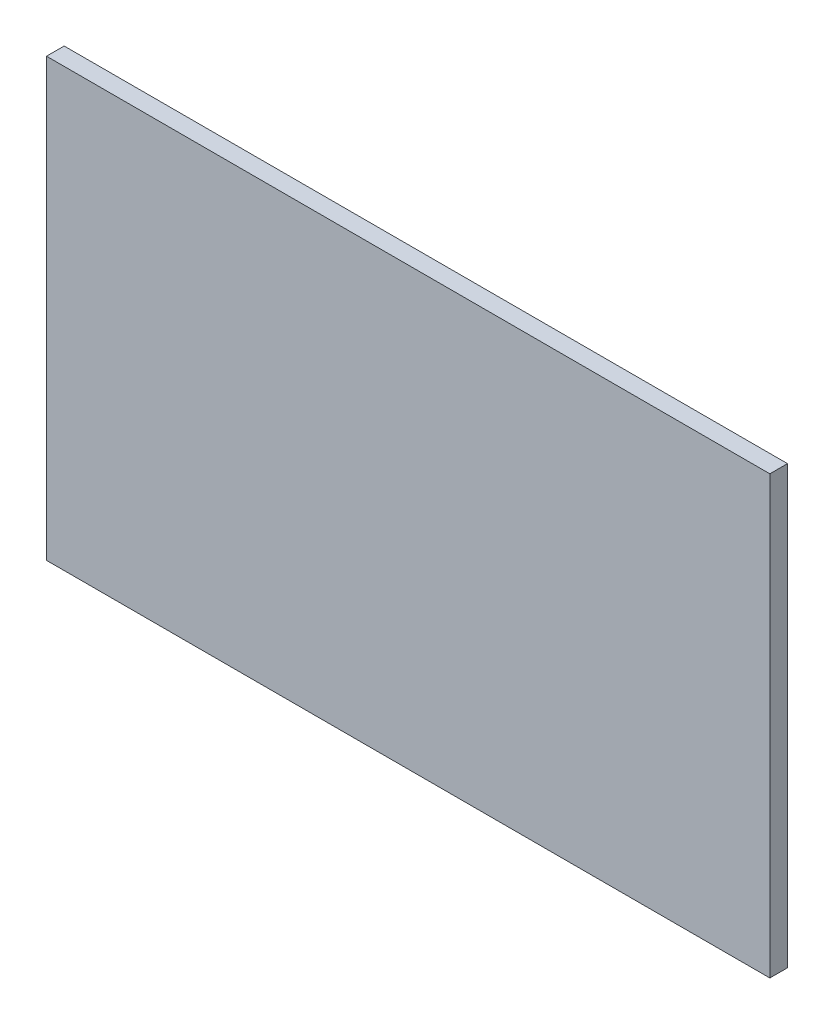
ISO-10303-21;
HEADER;
FILE_DESCRIPTION(('STEP AP214'),'2;1');
FILE_NAME('part.step','',(''),(''),'','','');
FILE_SCHEMA(('AUTOMOTIVE_DESIGN { 1 0 10303 214 1 1 1 1 }'));
ENDSEC;
DATA;
#1=APPLICATION_CONTEXT('core data for automotive mechanical design processes');
#2=APPLICATION_PROTOCOL_DEFINITION('international standard','automotive_design',2000,#1);
#3=PRODUCT_CONTEXT('',#1,'mechanical');
#4=PRODUCT('Part','Part','',(#3));
#5=PRODUCT_RELATED_PRODUCT_CATEGORY('part','',(#4));
#6=PRODUCT_DEFINITION_FORMATION('','',#4);
#7=PRODUCT_DEFINITION_CONTEXT('part definition',#1,'design');
#8=PRODUCT_DEFINITION('design','',#6,#7);
#9=PRODUCT_DEFINITION_SHAPE('','',#8);
#10=(LENGTH_UNIT() NAMED_UNIT(*) SI_UNIT(.MILLI.,.METRE.));
#11=(NAMED_UNIT(*) PLANE_ANGLE_UNIT() SI_UNIT($,.RADIAN.));
#12=(NAMED_UNIT(*) SI_UNIT($,.STERADIAN.) SOLID_ANGLE_UNIT());
#13=UNCERTAINTY_MEASURE_WITH_UNIT(LENGTH_MEASURE(1.E-05),#10,'distance_accuracy_value','');
#14=(GEOMETRIC_REPRESENTATION_CONTEXT(3) GLOBAL_UNCERTAINTY_ASSIGNED_CONTEXT((#13)) GLOBAL_UNIT_ASSIGNED_CONTEXT((#10,
#11,#12)) REPRESENTATION_CONTEXT('',''));
#15=CARTESIAN_POINT('',(0.,0.,0.));
#16=DIRECTION('',(0.,0.,1.));
#17=DIRECTION('',(1.,0.,0.));
#18=AXIS2_PLACEMENT_3D('',#15,#16,#17);
#19=CARTESIAN_POINT('',(0.,0.,40.));
#20=DIRECTION('',(1.,0.,0.));
#21=DIRECTION('',(0.,0.,-1.));
#22=AXIS2_PLACEMENT_3D('',#19,#20,#21);
#23=PLANE('',#22);
#24=DIRECTION('',(0.,-1.,0.));
#25=VECTOR('',#24,1.);
#26=CARTESIAN_POINT('',(0.,0.,0.));
#27=LINE('',#26,#25);
#28=CARTESIAN_POINT('',(0.,990.,0.));
#29=VERTEX_POINT('',#28);
#30=CARTESIAN_POINT('',(0.,0.,0.));
#31=VERTEX_POINT('',#30);
#32=EDGE_CURVE('E96',#29,#31,#27,.T.);
#33=ORIENTED_EDGE('',*,*,#32,.T.);
#34=DIRECTION('',(0.,0.,-1.));
#35=VECTOR('',#34,1.);
#36=CARTESIAN_POINT('',(0.,0.,40.));
#37=LINE('',#36,#35);
#38=CARTESIAN_POINT('',(0.,0.,40.));
#39=VERTEX_POINT('',#38);
#40=EDGE_CURVE('E11',#39,#31,#37,.T.);
#41=ORIENTED_EDGE('',*,*,#40,.F.);
#42=DIRECTION('',(0.,-1.,0.));
#43=VECTOR('',#42,1.);
#44=CARTESIAN_POINT('',(0.,0.,40.));
#45=LINE('',#44,#43);
#46=CARTESIAN_POINT('',(0.,990.,40.));
#47=VERTEX_POINT('',#46);
#48=EDGE_CURVE('E84',#47,#39,#45,.T.);
#49=ORIENTED_EDGE('',*,*,#48,.F.);
#50=DIRECTION('',(0.,0.,-1.));
#51=VECTOR('',#50,1.);
#52=CARTESIAN_POINT('',(0.,990.,40.));
#53=LINE('',#52,#51);
#54=EDGE_CURVE('E92',#47,#29,#53,.T.);
#55=ORIENTED_EDGE('',*,*,#54,.T.);
#56=EDGE_LOOP('',(#33,#41,#49,#55));
#57=FACE_BOUND('',#56,.T.);
#58=ADVANCED_FACE('F33',(#57),#23,.F.);
#59=CARTESIAN_POINT('',(0.,0.,40.));
#60=DIRECTION('',(0.,1.,0.));
#61=DIRECTION('',(0.,0.,1.));
#62=AXIS2_PLACEMENT_3D('',#59,#60,#61);
#63=PLANE('',#62);
#64=DIRECTION('',(1.,0.,0.));
#65=VECTOR('',#64,1.);
#66=CARTESIAN_POINT('',(0.,0.,0.));
#67=LINE('',#66,#65);
#68=CARTESIAN_POINT('',(1640.,0.,0.));
#69=VERTEX_POINT('',#68);
#70=EDGE_CURVE('E88',#31,#69,#67,.T.);
#71=ORIENTED_EDGE('',*,*,#70,.T.);
#72=DIRECTION('',(0.,0.,-1.));
#73=VECTOR('',#72,1.);
#74=CARTESIAN_POINT('',(1640.,0.,40.));
#75=LINE('',#74,#73);
#76=CARTESIAN_POINT('',(1640.,0.,40.));
#77=VERTEX_POINT('',#76);
#78=EDGE_CURVE('E41',#77,#69,#75,.T.);
#79=ORIENTED_EDGE('',*,*,#78,.F.);
#80=DIRECTION('',(1.,0.,0.));
#81=VECTOR('',#80,1.);
#82=CARTESIAN_POINT('',(0.,0.,40.));
#83=LINE('',#82,#81);
#84=EDGE_CURVE('E79',#39,#77,#83,.T.);
#85=ORIENTED_EDGE('',*,*,#84,.F.);
#86=ORIENTED_EDGE('',*,*,#40,.T.);
#87=EDGE_LOOP('',(#71,#79,#85,#86));
#88=FACE_BOUND('',#87,.T.);
#89=ADVANCED_FACE('F87',(#88),#63,.F.);
#90=CARTESIAN_POINT('',(1640.,0.,40.));
#91=DIRECTION('',(-1.,0.,0.));
#92=DIRECTION('',(0.,0.,1.));
#93=AXIS2_PLACEMENT_3D('',#90,#91,#92);
#94=PLANE('',#93);
#95=DIRECTION('',(0.,1.,0.));
#96=VECTOR('',#95,1.);
#97=CARTESIAN_POINT('',(1640.,0.,0.));
#98=LINE('',#97,#96);
#99=CARTESIAN_POINT('',(1640.,990.,0.));
#100=VERTEX_POINT('',#99);
#101=EDGE_CURVE('E66',#69,#100,#98,.T.);
#102=ORIENTED_EDGE('',*,*,#101,.T.);
#103=DIRECTION('',(0.,0.,-1.));
#104=VECTOR('',#103,1.);
#105=CARTESIAN_POINT('',(1640.,990.,40.));
#106=LINE('',#105,#104);
#107=CARTESIAN_POINT('',(1640.,990.,40.));
#108=VERTEX_POINT('',#107);
#109=EDGE_CURVE('E89',#108,#100,#106,.T.);
#110=ORIENTED_EDGE('',*,*,#109,.F.);
#111=DIRECTION('',(0.,1.,0.));
#112=VECTOR('',#111,1.);
#113=CARTESIAN_POINT('',(1640.,0.,40.));
#114=LINE('',#113,#112);
#115=EDGE_CURVE('E82',#77,#108,#114,.T.);
#116=ORIENTED_EDGE('',*,*,#115,.F.);
#117=ORIENTED_EDGE('',*,*,#78,.T.);
#118=EDGE_LOOP('',(#102,#110,#116,#117));
#119=FACE_BOUND('',#118,.T.);
#120=ADVANCED_FACE('F90',(#119),#94,.F.);
#121=CARTESIAN_POINT('',(0.,990.,40.));
#122=DIRECTION('',(0.,-1.,0.));
#123=DIRECTION('',(0.,0.,-1.));
#124=AXIS2_PLACEMENT_3D('',#121,#122,#123);
#125=PLANE('',#124);
#126=DIRECTION('',(-1.,0.,0.));
#127=VECTOR('',#126,1.);
#128=CARTESIAN_POINT('',(0.,990.,0.));
#129=LINE('',#128,#127);
#130=EDGE_CURVE('E72',#100,#29,#129,.T.);
#131=ORIENTED_EDGE('',*,*,#130,.T.);
#132=ORIENTED_EDGE('',*,*,#54,.F.);
#133=DIRECTION('',(-1.,0.,0.));
#134=VECTOR('',#133,1.);
#135=CARTESIAN_POINT('',(0.,990.,40.));
#136=LINE('',#135,#134);
#137=EDGE_CURVE('E49',#108,#47,#136,.T.);
#138=ORIENTED_EDGE('',*,*,#137,.F.);
#139=ORIENTED_EDGE('',*,*,#109,.T.);
#140=EDGE_LOOP('',(#131,#132,#138,#139));
#141=FACE_BOUND('',#140,.T.);
#142=ADVANCED_FACE('F103',(#141),#125,.F.);
#143=CARTESIAN_POINT('',(0.,0.,40.));
#144=DIRECTION('',(0.,0.,-1.));
#145=DIRECTION('',(-1.,0.,0.));
#146=AXIS2_PLACEMENT_3D('',#143,#144,#145);
#147=PLANE('',#146);
#148=ORIENTED_EDGE('',*,*,#48,.T.);
#149=ORIENTED_EDGE('',*,*,#84,.T.);
#150=ORIENTED_EDGE('',*,*,#115,.T.);
#151=ORIENTED_EDGE('',*,*,#137,.T.);
#152=EDGE_LOOP('',(#148,#149,#150,#151));
#153=FACE_BOUND('',#152,.T.);
#154=ADVANCED_FACE('F80',(#153),#147,.F.);
#155=CARTESIAN_POINT('',(0.,0.,0.));
#156=DIRECTION('',(0.,0.,-1.));
#157=DIRECTION('',(-1.,0.,0.));
#158=AXIS2_PLACEMENT_3D('',#155,#156,#157);
#159=PLANE('',#158);
#160=ORIENTED_EDGE('',*,*,#32,.F.);
#161=ORIENTED_EDGE('',*,*,#130,.F.);
#162=ORIENTED_EDGE('',*,*,#101,.F.);
#163=ORIENTED_EDGE('',*,*,#70,.F.);
#164=EDGE_LOOP('',(#160,#161,#162,#163));
#165=FACE_BOUND('',#164,.T.);
#166=ADVANCED_FACE('F106',(#165),#159,.T.);
#167=CLOSED_SHELL('',(#58,#89,#120,#142,#154,#166));
#168=MANIFOLD_SOLID_BREP('B2',#167);
#169=ADVANCED_BREP_SHAPE_REPRESENTATION('',(#18,#168),#14);
#170=SHAPE_DEFINITION_REPRESENTATION(#9,#169);
ENDSEC;
END-ISO-10303-21;
